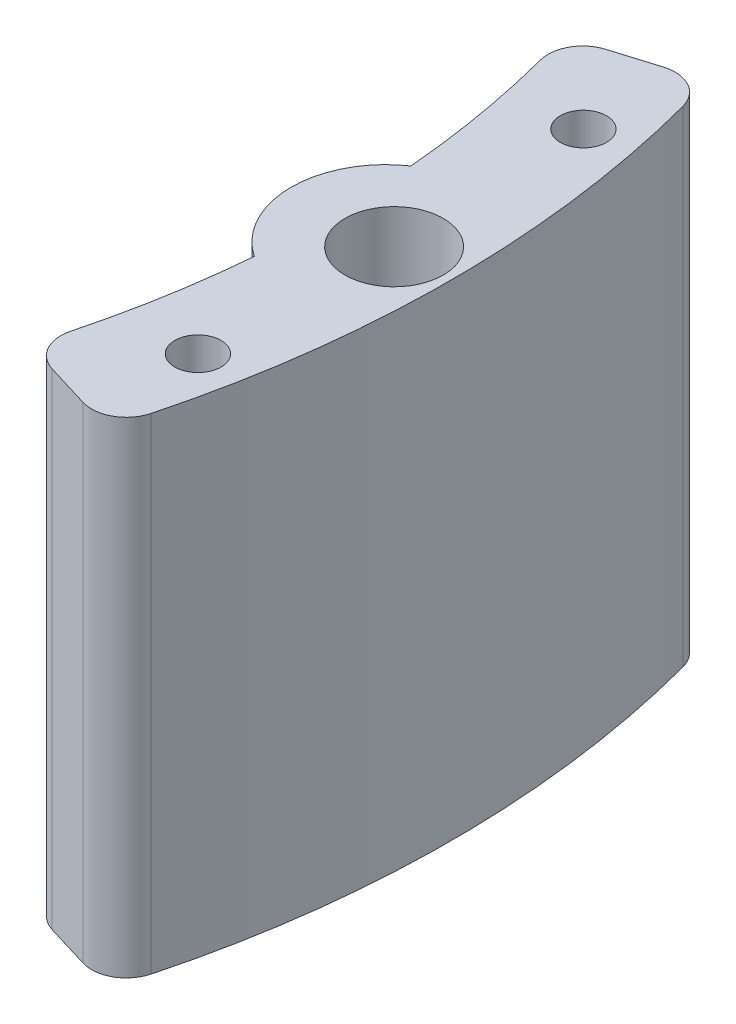
ISO-10303-21;
HEADER;
FILE_DESCRIPTION(('STEP AP214'),'2;1');
FILE_NAME('part.step','',(''),(''),'','','');
FILE_SCHEMA(('AUTOMOTIVE_DESIGN { 1 0 10303 214 1 1 1 1 }'));
ENDSEC;
DATA;
#1=APPLICATION_CONTEXT('core data for automotive mechanical design processes');
#2=APPLICATION_PROTOCOL_DEFINITION('international standard','automotive_design',2000,#1);
#3=PRODUCT_CONTEXT('',#1,'mechanical');
#4=PRODUCT('Part','Part','',(#3));
#5=PRODUCT_RELATED_PRODUCT_CATEGORY('part','',(#4));
#6=PRODUCT_DEFINITION_FORMATION('','',#4);
#7=PRODUCT_DEFINITION_CONTEXT('part definition',#1,'design');
#8=PRODUCT_DEFINITION('design','',#6,#7);
#9=PRODUCT_DEFINITION_SHAPE('','',#8);
#10=(LENGTH_UNIT() NAMED_UNIT(*) SI_UNIT(.MILLI.,.METRE.));
#11=(NAMED_UNIT(*) PLANE_ANGLE_UNIT() SI_UNIT($,.RADIAN.));
#12=(NAMED_UNIT(*) SI_UNIT($,.STERADIAN.) SOLID_ANGLE_UNIT());
#13=UNCERTAINTY_MEASURE_WITH_UNIT(LENGTH_MEASURE(1.E-05),#10,'distance_accuracy_value','');
#14=(GEOMETRIC_REPRESENTATION_CONTEXT(3) GLOBAL_UNCERTAINTY_ASSIGNED_CONTEXT((#13)) GLOBAL_UNIT_ASSIGNED_CONTEXT((#10,
#11,#12)) REPRESENTATION_CONTEXT('',''));
#15=CARTESIAN_POINT('',(0.,0.,0.));
#16=DIRECTION('',(0.,0.,1.));
#17=DIRECTION('',(1.,0.,0.));
#18=AXIS2_PLACEMENT_3D('',#15,#16,#17);
#19=CARTESIAN_POINT('',(-84.3014474439977,42.,0.));
#20=DIRECTION('',(0.,-1.,0.));
#21=DIRECTION('',(0.,0.,-1.));
#22=AXIS2_PLACEMENT_3D('',#19,#20,#21);
#23=CYLINDRICAL_SURFACE('',#22,80.);
#24=DIRECTION('',(0.,-1.,0.));
#25=VECTOR('',#24,1.);
#26=CARTESIAN_POINT('',(-4.58853389125035,21.,6.77136713908091));
#27=LINE('',#26,#25);
#28=CARTESIAN_POINT('',(-4.58853389125035,0.,6.77136713908091));
#29=VERTEX_POINT('',#28);
#30=CARTESIAN_POINT('',(-4.58853389125033,42.,6.77136713908088));
#31=VERTEX_POINT('',#30);
#32=EDGE_CURVE('E136',#29,#31,#27,.F.);
#33=ORIENTED_EDGE('',*,*,#32,.F.);
#34=CARTESIAN_POINT('',(-84.3014474439977,0.,0.));
#35=DIRECTION('',(0.,-1.,0.));
#36=DIRECTION('',(0.,0.,1.));
#37=AXIS2_PLACEMENT_3D('',#34,#35,#36);
#38=CIRCLE('',#37,80.);
#39=CARTESIAN_POINT('',(-6.9228749005604,0.,20.3114871720416));
#40=VERTEX_POINT('',#39);
#41=EDGE_CURVE('E123',#29,#40,#38,.T.);
#42=ORIENTED_EDGE('',*,*,#41,.T.);
#43=DIRECTION('',(0.,-1.,0.));
#44=VECTOR('',#43,1.);
#45=CARTESIAN_POINT('',(-6.9228749005604,42.,20.3114871720416));
#46=LINE('',#45,#44);
#47=CARTESIAN_POINT('',(-6.9228749005604,42.,20.3114871720416));
#48=VERTEX_POINT('',#47);
#49=EDGE_CURVE('E229',#40,#48,#46,.F.);
#50=ORIENTED_EDGE('',*,*,#49,.T.);
#51=CARTESIAN_POINT('',(-84.3014474439977,42.,0.));
#52=DIRECTION('',(0.,-1.,0.));
#53=DIRECTION('',(0.,0.,1.));
#54=AXIS2_PLACEMENT_3D('',#51,#52,#53);
#55=CIRCLE('',#54,80.);
#56=EDGE_CURVE('E59',#31,#48,#55,.T.);
#57=ORIENTED_EDGE('',*,*,#56,.F.);
#58=EDGE_LOOP('',(#33,#42,#50,#57));
#59=FACE_BOUND('',#58,.T.);
#60=ADVANCED_FACE('F43',(#59),#23,.F.);
#61=DIRECTION('',(0.,-1.,0.));
#62=VECTOR('',#61,1.);
#63=CARTESIAN_POINT('',(-4.58853389125035,21.,-6.77136713908091));
#64=LINE('',#63,#62);
#65=CARTESIAN_POINT('',(-4.58853389125033,42.,-6.77136713908088));
#66=VERTEX_POINT('',#65);
#67=CARTESIAN_POINT('',(-4.58853389125033,0.,-6.77136713908088));
#68=VERTEX_POINT('',#67);
#69=EDGE_CURVE('E67',#66,#68,#64,.T.);
#70=ORIENTED_EDGE('',*,*,#69,.F.);
#71=CARTESIAN_POINT('',(-6.9228749005604,42.,-20.3114871720416));
#72=VERTEX_POINT('',#71);
#73=EDGE_CURVE('E164',#72,#66,#55,.T.);
#74=ORIENTED_EDGE('',*,*,#73,.F.);
#75=DIRECTION('',(0.,-1.,0.));
#76=VECTOR('',#75,1.);
#77=CARTESIAN_POINT('',(-6.9228749005604,42.,-20.3114871720416));
#78=LINE('',#77,#76);
#79=CARTESIAN_POINT('',(-6.9228749005604,0.,-20.3114871720416));
#80=VERTEX_POINT('',#79);
#81=EDGE_CURVE('E232',#72,#80,#78,.T.);
#82=ORIENTED_EDGE('',*,*,#81,.T.);
#83=EDGE_CURVE('E133',#80,#68,#38,.T.);
#84=ORIENTED_EDGE('',*,*,#83,.T.);
#85=EDGE_LOOP('',(#70,#74,#82,#84));
#86=FACE_BOUND('',#85,.T.);
#87=ADVANCED_FACE('F266',(#86),#23,.F.);
#88=CARTESIAN_POINT('',(-7.70531331828415,42.,23.0874909203165));
#89=DIRECTION('',(0.291249910817092,0.,-0.956647003575005));
#90=DIRECTION('',(-0.956647003575005,0.,-0.291249910817092));
#91=AXIS2_PLACEMENT_3D('',#88,#89,#90);
#92=PLANE('',#91);
#93=DIRECTION('',(0.956647003575005,0.,0.291249910817092));
#94=VECTOR('',#93,1.);
#95=CARTESIAN_POINT('',(-7.70531331828415,42.,23.0874909203165));
#96=LINE('',#95,#94);
#97=CARTESIAN_POINT('',(-4.89492816263278,42.,23.9431089517182));
#98=VERTEX_POINT('',#97);
#99=CARTESIAN_POINT('',(-1.06558646064553,42.,25.1089469515489));
#100=VERTEX_POINT('',#99);
#101=EDGE_CURVE('E167',#98,#100,#96,.T.);
#102=ORIENTED_EDGE('',*,*,#101,.F.);
#103=DIRECTION('',(0.,-1.,0.));
#104=VECTOR('',#103,1.);
#105=CARTESIAN_POINT('',(-4.89492816263278,42.,23.9431089517182));
#106=LINE('',#105,#104);
#107=CARTESIAN_POINT('',(-4.89492816263278,0.,23.9431089517182));
#108=VERTEX_POINT('',#107);
#109=EDGE_CURVE('E11',#98,#108,#106,.T.);
#110=ORIENTED_EDGE('',*,*,#109,.T.);
#111=DIRECTION('',(0.956647003575005,0.,0.291249910817092));
#112=VECTOR('',#111,1.);
#113=CARTESIAN_POINT('',(-7.70531331828415,0.,23.0874909203165));
#114=LINE('',#113,#112);
#115=CARTESIAN_POINT('',(-1.06558646064553,0.,25.1089469515489));
#116=VERTEX_POINT('',#115);
#117=EDGE_CURVE('E181',#108,#116,#114,.T.);
#118=ORIENTED_EDGE('',*,*,#117,.T.);
#119=DIRECTION('',(0.,-1.,0.));
#120=VECTOR('',#119,1.);
#121=CARTESIAN_POINT('',(-1.06558646064553,42.,25.1089469515489));
#122=LINE('',#121,#120);
#123=EDGE_CURVE('E52',#116,#100,#122,.F.);
#124=ORIENTED_EDGE('',*,*,#123,.T.);
#125=EDGE_LOOP('',(#102,#110,#118,#124));
#126=FACE_BOUND('',#125,.T.);
#127=ADVANCED_FACE('F239',(#126),#92,.F.);
#128=CARTESIAN_POINT('',(-84.3014474439977,42.,0.));
#129=DIRECTION('',(0.,-1.,0.));
#130=DIRECTION('',(0.,0.,-1.));
#131=AXIS2_PLACEMENT_3D('',#128,#129,#130);
#132=CYLINDRICAL_SURFACE('',#131,90.);
#133=CARTESIAN_POINT('',(-84.3014474439977,0.,0.));
#134=DIRECTION('',(0.,1.,0.));
#135=DIRECTION('',(0.,0.,1.));
#136=AXIS2_PLACEMENT_3D('',#133,#134,#135);
#137=CIRCLE('',#136,90.);
#138=CARTESIAN_POINT('',(2.70849467579899,0.,23.0058682146454));
#139=VERTEX_POINT('',#138);
#140=CARTESIAN_POINT('',(2.70849467579898,0.,-23.0058682146454));
#141=VERTEX_POINT('',#140);
#142=EDGE_CURVE('E185',#139,#141,#137,.T.);
#143=ORIENTED_EDGE('',*,*,#142,.T.);
#144=DIRECTION('',(0.,-1.,0.));
#145=VECTOR('',#144,1.);
#146=CARTESIAN_POINT('',(2.70849467579898,42.,-23.0058682146454));
#147=LINE('',#146,#145);
#148=CARTESIAN_POINT('',(2.70849467579898,42.,-23.0058682146454));
#149=VERTEX_POINT('',#148);
#150=EDGE_CURVE('E214',#141,#149,#147,.F.);
#151=ORIENTED_EDGE('',*,*,#150,.T.);
#152=CARTESIAN_POINT('',(-84.3014474439977,42.,0.));
#153=DIRECTION('',(0.,1.,0.));
#154=DIRECTION('',(0.,0.,1.));
#155=AXIS2_PLACEMENT_3D('',#152,#153,#154);
#156=CIRCLE('',#155,90.);
#157=CARTESIAN_POINT('',(2.70849467579899,42.,23.0058682146454));
#158=VERTEX_POINT('',#157);
#159=EDGE_CURVE('E171',#158,#149,#156,.T.);
#160=ORIENTED_EDGE('',*,*,#159,.F.);
#161=DIRECTION('',(0.,-1.,0.));
#162=VECTOR('',#161,1.);
#163=CARTESIAN_POINT('',(2.70849467579898,42.,23.0058682146454));
#164=LINE('',#163,#162);
#165=EDGE_CURVE('E210',#158,#139,#164,.T.);
#166=ORIENTED_EDGE('',*,*,#165,.T.);
#167=EDGE_LOOP('',(#143,#151,#160,#166));
#168=FACE_BOUND('',#167,.T.);
#169=ADVANCED_FACE('F251',(#168),#132,.T.);
#170=CARTESIAN_POINT('',(-7.70531331828414,42.,-23.0874909203166));
#171=DIRECTION('',(0.29124991081709,0.,0.956647003575006));
#172=DIRECTION('',(0.956647003575006,0.,-0.291249910817091));
#173=AXIS2_PLACEMENT_3D('',#170,#171,#172);
#174=PLANE('',#173);
#175=DIRECTION('',(-0.956647003575006,0.,0.291249910817091));
#176=VECTOR('',#175,1.);
#177=CARTESIAN_POINT('',(-7.70531331828414,42.,-23.0874909203166));
#178=LINE('',#177,#176);
#179=CARTESIAN_POINT('',(-1.06558646064554,42.,-25.1089469515489));
#180=VERTEX_POINT('',#179);
#181=CARTESIAN_POINT('',(-4.8949281626328,42.,-23.9431089517182));
#182=VERTEX_POINT('',#181);
#183=EDGE_CURVE('E175',#180,#182,#178,.T.);
#184=ORIENTED_EDGE('',*,*,#183,.F.);
#185=DIRECTION('',(0.,-1.,0.));
#186=VECTOR('',#185,1.);
#187=CARTESIAN_POINT('',(-1.06558646064554,42.,-25.1089469515489));
#188=LINE('',#187,#186);
#189=CARTESIAN_POINT('',(-1.06558646064554,0.,-25.1089469515489));
#190=VERTEX_POINT('',#189);
#191=EDGE_CURVE('E195',#180,#190,#188,.T.);
#192=ORIENTED_EDGE('',*,*,#191,.T.);
#193=DIRECTION('',(-0.956647003575006,0.,0.291249910817091));
#194=VECTOR('',#193,1.);
#195=CARTESIAN_POINT('',(-7.70531331828414,0.,-23.0874909203166));
#196=LINE('',#195,#194);
#197=CARTESIAN_POINT('',(-4.8949281626328,0.,-23.9431089517182));
#198=VERTEX_POINT('',#197);
#199=EDGE_CURVE('E189',#190,#198,#196,.T.);
#200=ORIENTED_EDGE('',*,*,#199,.T.);
#201=DIRECTION('',(0.,-1.,0.));
#202=VECTOR('',#201,1.);
#203=CARTESIAN_POINT('',(-4.8949281626328,42.,-23.9431089517182));
#204=LINE('',#203,#202);
#205=EDGE_CURVE('E178',#198,#182,#204,.F.);
#206=ORIENTED_EDGE('',*,*,#205,.T.);
#207=EDGE_LOOP('',(#184,#192,#200,#206));
#208=FACE_BOUND('',#207,.T.);
#209=ADVANCED_FACE('F260',(#208),#174,.F.);
#210=CARTESIAN_POINT('',(-84.3014474439977,42.,0.));
#211=DIRECTION('',(0.,1.,0.));
#212=DIRECTION('',(0.,0.,1.));
#213=AXIS2_PLACEMENT_3D('',#210,#211,#212);
#214=PLANE('',#213);
#215=CARTESIAN_POINT('',(0.266407335288432,42.,16.5));
#216=DIRECTION('',(0.,-1.,0.));
#217=DIRECTION('',(0.,0.,-1.));
#218=AXIS2_PLACEMENT_3D('',#215,#216,#217);
#219=CIRCLE('',#218,2.);
#220=CARTESIAN_POINT('',(0.266407335288432,42.,14.5));
#221=VERTEX_POINT('',#220);
#222=EDGE_CURVE('E146',#221,#221,#219,.T.);
#223=ORIENTED_EDGE('',*,*,#222,.T.);
#224=EDGE_LOOP('',(#223));
#225=FACE_BOUND('',#224,.T.);
#226=CARTESIAN_POINT('',(0.106129728212272,42.,-17.));
#227=DIRECTION('',(0.,-1.,0.));
#228=DIRECTION('',(0.,0.,-1.));
#229=AXIS2_PLACEMENT_3D('',#226,#227,#228);
#230=CIRCLE('',#229,2.);
#231=CARTESIAN_POINT('',(0.106129728212272,42.,-19.));
#232=VERTEX_POINT('',#231);
#233=EDGE_CURVE('E446',#232,#232,#230,.T.);
#234=ORIENTED_EDGE('',*,*,#233,.T.);
#235=EDGE_LOOP('',(#234));
#236=FACE_BOUND('',#235,.T.);
#237=ORIENTED_EDGE('',*,*,#73,.T.);
#238=CARTESIAN_POINT('',(0.,42.,0.));
#239=DIRECTION('',(0.,1.,0.));
#240=DIRECTION('',(0.,0.,1.));
#241=AXIS2_PLACEMENT_3D('',#238,#239,#240);
#242=CIRCLE('',#241,8.17961222817915);
#243=EDGE_CURVE('E145',#66,#31,#242,.T.);
#244=ORIENTED_EDGE('',*,*,#243,.T.);
#245=ORIENTED_EDGE('',*,*,#56,.T.);
#246=CARTESIAN_POINT('',(-4.0211784301815,42.,21.0731679409932));
#247=DIRECTION('',(0.,1.,0.));
#248=DIRECTION('',(0.,0.,1.));
#249=AXIS2_PLACEMENT_3D('',#246,#247,#248);
#250=CIRCLE('',#249,3.);
#251=EDGE_CURVE('E220',#48,#98,#250,.T.);
#252=ORIENTED_EDGE('',*,*,#251,.T.);
#253=ORIENTED_EDGE('',*,*,#101,.T.);
#254=CARTESIAN_POINT('',(-0.191836728194256,42.,22.2390059408239));
#255=DIRECTION('',(0.,1.,0.));
#256=DIRECTION('',(0.,0.,1.));
#257=AXIS2_PLACEMENT_3D('',#254,#255,#256);
#258=CIRCLE('',#257,3.);
#259=EDGE_CURVE('E217',#100,#158,#258,.T.);
#260=ORIENTED_EDGE('',*,*,#259,.T.);
#261=ORIENTED_EDGE('',*,*,#159,.T.);
#262=CARTESIAN_POINT('',(-0.19183672819427,42.,-22.2390059408239));
#263=DIRECTION('',(0.,1.,0.));
#264=DIRECTION('',(0.,0.,1.));
#265=AXIS2_PLACEMENT_3D('',#262,#263,#264);
#266=CIRCLE('',#265,3.);
#267=EDGE_CURVE('E226',#149,#180,#266,.T.);
#268=ORIENTED_EDGE('',*,*,#267,.T.);
#269=ORIENTED_EDGE('',*,*,#183,.T.);
#270=CARTESIAN_POINT('',(-4.02117843018153,42.,-21.0731679409932));
#271=DIRECTION('',(0.,1.,0.));
#272=DIRECTION('',(0.,0.,1.));
#273=AXIS2_PLACEMENT_3D('',#270,#271,#272);
#274=CIRCLE('',#273,3.);
#275=EDGE_CURVE('E223',#182,#72,#274,.T.);
#276=ORIENTED_EDGE('',*,*,#275,.T.);
#277=EDGE_LOOP('',(#237,#244,#245,#252,#253,#260,#261,#268,#269,#276));
#278=FACE_BOUND('',#277,.T.);
#279=CARTESIAN_POINT('',(0.733117744973949,42.,0.));
#280=DIRECTION('',(0.,1.,0.));
#281=DIRECTION('',(0.,0.,1.));
#282=AXIS2_PLACEMENT_3D('',#279,#280,#281);
#283=CIRCLE('',#282,4.25);
#284=CARTESIAN_POINT('',(0.733117744973949,42.,4.25));
#285=VERTEX_POINT('',#284);
#286=EDGE_CURVE('E141',#285,#285,#283,.T.);
#287=ORIENTED_EDGE('',*,*,#286,.F.);
#288=EDGE_LOOP('',(#287));
#289=FACE_BOUND('',#288,.T.);
#290=ADVANCED_FACE('F244',(#225,#236,#278,#289),#214,.T.);
#291=CARTESIAN_POINT('',(-84.3014474439977,0.,0.));
#292=DIRECTION('',(0.,1.,0.));
#293=DIRECTION('',(0.,0.,1.));
#294=AXIS2_PLACEMENT_3D('',#291,#292,#293);
#295=PLANE('',#294);
#296=CARTESIAN_POINT('',(0.266407335288432,0.,16.5));
#297=DIRECTION('',(0.,-1.,0.));
#298=DIRECTION('',(0.,0.,-1.));
#299=AXIS2_PLACEMENT_3D('',#296,#297,#298);
#300=CIRCLE('',#299,2.);
#301=CARTESIAN_POINT('',(0.266407335288432,0.,14.5));
#302=VERTEX_POINT('',#301);
#303=EDGE_CURVE('E152',#302,#302,#300,.T.);
#304=ORIENTED_EDGE('',*,*,#303,.F.);
#305=EDGE_LOOP('',(#304));
#306=FACE_BOUND('',#305,.T.);
#307=CARTESIAN_POINT('',(0.106129728212272,0.,-17.));
#308=DIRECTION('',(0.,-1.,0.));
#309=DIRECTION('',(0.,0.,-1.));
#310=AXIS2_PLACEMENT_3D('',#307,#308,#309);
#311=CIRCLE('',#310,2.);
#312=CARTESIAN_POINT('',(0.106129728212272,0.,-19.));
#313=VERTEX_POINT('',#312);
#314=EDGE_CURVE('E450',#313,#313,#311,.T.);
#315=ORIENTED_EDGE('',*,*,#314,.F.);
#316=EDGE_LOOP('',(#315));
#317=FACE_BOUND('',#316,.T.);
#318=ORIENTED_EDGE('',*,*,#41,.F.);
#319=CARTESIAN_POINT('',(0.,0.,0.));
#320=DIRECTION('',(0.,1.,0.));
#321=DIRECTION('',(0.,0.,1.));
#322=AXIS2_PLACEMENT_3D('',#319,#320,#321);
#323=CIRCLE('',#322,8.17961222817915);
#324=EDGE_CURVE('E128',#68,#29,#323,.T.);
#325=ORIENTED_EDGE('',*,*,#324,.F.);
#326=ORIENTED_EDGE('',*,*,#83,.F.);
#327=CARTESIAN_POINT('',(-4.02117843018153,0.,-21.0731679409932));
#328=DIRECTION('',(0.,1.,0.));
#329=DIRECTION('',(0.,0.,1.));
#330=AXIS2_PLACEMENT_3D('',#327,#328,#329);
#331=CIRCLE('',#330,3.);
#332=EDGE_CURVE('E204',#80,#198,#331,.F.);
#333=ORIENTED_EDGE('',*,*,#332,.T.);
#334=ORIENTED_EDGE('',*,*,#199,.F.);
#335=CARTESIAN_POINT('',(-0.19183672819427,0.,-22.2390059408239));
#336=DIRECTION('',(0.,1.,0.));
#337=DIRECTION('',(0.,0.,1.));
#338=AXIS2_PLACEMENT_3D('',#335,#336,#337);
#339=CIRCLE('',#338,3.);
#340=EDGE_CURVE('E207',#190,#141,#339,.F.);
#341=ORIENTED_EDGE('',*,*,#340,.T.);
#342=ORIENTED_EDGE('',*,*,#142,.F.);
#343=CARTESIAN_POINT('',(-0.191836728194256,0.,22.2390059408239));
#344=DIRECTION('',(0.,1.,0.));
#345=DIRECTION('',(0.,0.,1.));
#346=AXIS2_PLACEMENT_3D('',#343,#344,#345);
#347=CIRCLE('',#346,3.);
#348=EDGE_CURVE('E199',#139,#116,#347,.F.);
#349=ORIENTED_EDGE('',*,*,#348,.T.);
#350=ORIENTED_EDGE('',*,*,#117,.F.);
#351=CARTESIAN_POINT('',(-4.0211784301815,0.,21.0731679409932));
#352=DIRECTION('',(0.,1.,0.));
#353=DIRECTION('',(0.,0.,1.));
#354=AXIS2_PLACEMENT_3D('',#351,#352,#353);
#355=CIRCLE('',#354,3.);
#356=EDGE_CURVE('E130',#108,#40,#355,.F.);
#357=ORIENTED_EDGE('',*,*,#356,.T.);
#358=EDGE_LOOP('',(#318,#325,#326,#333,#334,#341,#342,#349,#350,#357));
#359=FACE_BOUND('',#358,.T.);
#360=CARTESIAN_POINT('',(0.733117744973949,0.,0.));
#361=DIRECTION('',(0.,1.,0.));
#362=DIRECTION('',(0.,0.,1.));
#363=AXIS2_PLACEMENT_3D('',#360,#361,#362);
#364=CIRCLE('',#363,4.25);
#365=CARTESIAN_POINT('',(0.733117744973949,0.,4.25));
#366=VERTEX_POINT('',#365);
#367=EDGE_CURVE('E134',#366,#366,#364,.T.);
#368=ORIENTED_EDGE('',*,*,#367,.T.);
#369=EDGE_LOOP('',(#368));
#370=FACE_BOUND('',#369,.T.);
#371=ADVANCED_FACE('F124',(#306,#317,#359,#370),#295,.F.);
#372=CARTESIAN_POINT('',(-0.19183672819427,42.,-22.2390059408239));
#373=DIRECTION('',(0.,-1.,0.));
#374=DIRECTION('',(0.,0.,-1.));
#375=AXIS2_PLACEMENT_3D('',#372,#373,#374);
#376=CYLINDRICAL_SURFACE('',#375,3.);
#377=ORIENTED_EDGE('',*,*,#267,.F.);
#378=ORIENTED_EDGE('',*,*,#150,.F.);
#379=ORIENTED_EDGE('',*,*,#340,.F.);
#380=ORIENTED_EDGE('',*,*,#191,.F.);
#381=EDGE_LOOP('',(#377,#378,#379,#380));
#382=FACE_BOUND('',#381,.T.);
#383=ADVANCED_FACE('F257',(#382),#376,.T.);
#384=CARTESIAN_POINT('',(-4.02117843018153,42.,-21.0731679409932));
#385=DIRECTION('',(0.,-1.,0.));
#386=DIRECTION('',(0.,0.,-1.));
#387=AXIS2_PLACEMENT_3D('',#384,#385,#386);
#388=CYLINDRICAL_SURFACE('',#387,3.);
#389=ORIENTED_EDGE('',*,*,#275,.F.);
#390=ORIENTED_EDGE('',*,*,#205,.F.);
#391=ORIENTED_EDGE('',*,*,#332,.F.);
#392=ORIENTED_EDGE('',*,*,#81,.F.);
#393=EDGE_LOOP('',(#389,#390,#391,#392));
#394=FACE_BOUND('',#393,.T.);
#395=ADVANCED_FACE('F265',(#394),#388,.T.);
#396=CARTESIAN_POINT('',(-4.0211784301815,42.,21.0731679409932));
#397=DIRECTION('',(0.,-1.,0.));
#398=DIRECTION('',(0.,0.,-1.));
#399=AXIS2_PLACEMENT_3D('',#396,#397,#398);
#400=CYLINDRICAL_SURFACE('',#399,3.);
#401=ORIENTED_EDGE('',*,*,#251,.F.);
#402=ORIENTED_EDGE('',*,*,#49,.F.);
#403=ORIENTED_EDGE('',*,*,#356,.F.);
#404=ORIENTED_EDGE('',*,*,#109,.F.);
#405=EDGE_LOOP('',(#401,#402,#403,#404));
#406=FACE_BOUND('',#405,.T.);
#407=ADVANCED_FACE('F269',(#406),#400,.T.);
#408=CARTESIAN_POINT('',(-0.191836728194256,42.,22.2390059408239));
#409=DIRECTION('',(0.,-1.,0.));
#410=DIRECTION('',(0.,0.,-1.));
#411=AXIS2_PLACEMENT_3D('',#408,#409,#410);
#412=CYLINDRICAL_SURFACE('',#411,3.);
#413=ORIENTED_EDGE('',*,*,#259,.F.);
#414=ORIENTED_EDGE('',*,*,#123,.F.);
#415=ORIENTED_EDGE('',*,*,#348,.F.);
#416=ORIENTED_EDGE('',*,*,#165,.F.);
#417=EDGE_LOOP('',(#413,#414,#415,#416));
#418=FACE_BOUND('',#417,.T.);
#419=ADVANCED_FACE('F45',(#418),#412,.T.);
#420=CARTESIAN_POINT('',(0.733117744973949,0.,0.));
#421=DIRECTION('',(0.,1.,0.));
#422=DIRECTION('',(0.,0.,1.));
#423=AXIS2_PLACEMENT_3D('',#420,#421,#422);
#424=CYLINDRICAL_SURFACE('',#423,4.25);
#425=CARTESIAN_POINT('',(0.733117744973949,0.,4.25));
#426=CARTESIAN_POINT('',(0.733117744973949,0.437499999999999,4.25));
#427=CARTESIAN_POINT('',(0.733117744973949,0.875,4.25));
#428=CARTESIAN_POINT('',(0.733117744973949,1.75,4.25));
#429=CARTESIAN_POINT('',(0.733117744973949,2.1875,4.25));
#430=CARTESIAN_POINT('',(0.733117744973949,3.0625,4.25));
#431=CARTESIAN_POINT('',(0.733117744973949,3.5,4.25));
#432=CARTESIAN_POINT('',(0.733117744973949,4.375,4.25));
#433=CARTESIAN_POINT('',(0.733117744973949,4.8125,4.25));
#434=CARTESIAN_POINT('',(0.733117744973949,5.6875,4.25));
#435=CARTESIAN_POINT('',(0.733117744973949,6.125,4.25));
#436=CARTESIAN_POINT('',(0.733117744973949,7.,4.25));
#437=CARTESIAN_POINT('',(0.733117744973949,7.4375,4.25));
#438=CARTESIAN_POINT('',(0.733117744973949,8.3125,4.25));
#439=CARTESIAN_POINT('',(0.733117744973949,8.75,4.25));
#440=CARTESIAN_POINT('',(0.733117744973949,9.625,4.25));
#441=CARTESIAN_POINT('',(0.733117744973949,10.0625,4.25));
#442=CARTESIAN_POINT('',(0.733117744973949,10.9375,4.25));
#443=CARTESIAN_POINT('',(0.733117744973949,11.375,4.25));
#444=CARTESIAN_POINT('',(0.733117744973949,12.25,4.25));
#445=CARTESIAN_POINT('',(0.733117744973949,12.6875,4.25));
#446=CARTESIAN_POINT('',(0.733117744973949,13.5625,4.25));
#447=CARTESIAN_POINT('',(0.733117744973949,14.,4.25));
#448=CARTESIAN_POINT('',(0.733117744973949,14.875,4.25));
#449=CARTESIAN_POINT('',(0.733117744973949,15.3125,4.25));
#450=CARTESIAN_POINT('',(0.733117744973949,16.1875,4.25));
#451=CARTESIAN_POINT('',(0.733117744973949,16.625,4.25));
#452=CARTESIAN_POINT('',(0.733117744973949,17.5,4.25));
#453=CARTESIAN_POINT('',(0.733117744973949,17.9375,4.25));
#454=CARTESIAN_POINT('',(0.733117744973949,18.8125,4.25));
#455=CARTESIAN_POINT('',(0.733117744973949,19.25,4.25));
#456=CARTESIAN_POINT('',(0.733117744973949,20.125,4.25));
#457=CARTESIAN_POINT('',(0.733117744973949,20.5625,4.25));
#458=CARTESIAN_POINT('',(0.733117744973949,21.4375,4.25));
#459=CARTESIAN_POINT('',(0.733117744973949,21.875,4.25));
#460=CARTESIAN_POINT('',(0.733117744973949,22.75,4.25));
#461=CARTESIAN_POINT('',(0.733117744973949,23.1875,4.25));
#462=CARTESIAN_POINT('',(0.733117744973949,24.0625,4.25));
#463=CARTESIAN_POINT('',(0.733117744973949,24.5,4.25));
#464=CARTESIAN_POINT('',(0.733117744973949,25.375,4.25));
#465=CARTESIAN_POINT('',(0.733117744973949,25.8125,4.25));
#466=CARTESIAN_POINT('',(0.733117744973949,26.6875,4.25));
#467=CARTESIAN_POINT('',(0.733117744973949,27.125,4.25));
#468=CARTESIAN_POINT('',(0.733117744973949,28.,4.25));
#469=CARTESIAN_POINT('',(0.733117744973949,28.4375,4.25));
#470=CARTESIAN_POINT('',(0.733117744973949,29.3125,4.25));
#471=CARTESIAN_POINT('',(0.733117744973949,29.75,4.25));
#472=CARTESIAN_POINT('',(0.733117744973949,30.625,4.25));
#473=CARTESIAN_POINT('',(0.733117744973949,31.0625,4.25));
#474=CARTESIAN_POINT('',(0.733117744973949,31.9375,4.25));
#475=CARTESIAN_POINT('',(0.733117744973949,32.375,4.25));
#476=CARTESIAN_POINT('',(0.733117744973949,33.25,4.25));
#477=CARTESIAN_POINT('',(0.733117744973949,33.6875,4.25));
#478=CARTESIAN_POINT('',(0.733117744973949,34.5625,4.25));
#479=CARTESIAN_POINT('',(0.733117744973949,35.,4.25));
#480=CARTESIAN_POINT('',(0.733117744973949,35.875,4.25));
#481=CARTESIAN_POINT('',(0.733117744973949,36.3125,4.25));
#482=CARTESIAN_POINT('',(0.733117744973949,37.1875,4.25));
#483=CARTESIAN_POINT('',(0.733117744973949,37.625,4.25));
#484=CARTESIAN_POINT('',(0.733117744973949,38.5,4.25));
#485=CARTESIAN_POINT('',(0.733117744973949,38.9375,4.25));
#486=CARTESIAN_POINT('',(0.733117744973949,39.8125,4.25));
#487=CARTESIAN_POINT('',(0.733117744973949,40.25,4.25));
#488=CARTESIAN_POINT('',(0.733117744973949,41.125,4.25));
#489=CARTESIAN_POINT('',(0.733117744973949,41.5625,4.25));
#490=CARTESIAN_POINT('',(0.733117744973949,42.,4.25));
#491=B_SPLINE_CURVE_WITH_KNOTS('',3,(#425,#426,#427,#428,#429,#430,#431,#432,#433,#434,#435,
#436,#437,#438,#439,#440,#441,#442,#443,#444,#445,#446,#447,#448,#449,#450,#451,#452,#453,#454,
#455,#456,#457,#458,#459,#460,#461,#462,#463,#464,#465,#466,#467,#468,#469,#470,#471,#472,#473,
#474,#475,#476,#477,#478,#479,#480,#481,#482,#483,#484,#485,#486,#487,#488,#489,#490),
.UNSPECIFIED.,.F.,.F.,(4,2,2,2,2,2,2,2,2,2,2,2,2,2,2,2,2,2,2,2,2,2,2,2,2,2,2,2,2,2,2,2,4),(0.,
1.3125,2.625,3.9375,5.25,6.5625,7.875,9.1875,10.5,11.8125,13.125,14.4375,15.75,17.0625,18.375,
19.6875,21.,22.3125,23.625,24.9375,26.25,27.5625,28.875,30.1875,31.5,32.8125,34.125,35.4375,
36.75,38.0625,39.375,40.6875,42.),.UNSPECIFIED.);
#492=EDGE_CURVE('BSEAM275',#366,#285,#491,.T.);
#493=ORIENTED_EDGE('',*,*,#367,.F.);
#494=ORIENTED_EDGE('',*,*,#286,.T.);
#495=ORIENTED_EDGE('',*,*,#492,.T.);
#496=ORIENTED_EDGE('',*,*,#492,.F.);
#497=EDGE_LOOP('',(#493,#495,#494,#496));
#498=FACE_BOUND('',#497,.T.);
#499=ADVANCED_FACE('F275',(#498),#424,.F.);
#500=CARTESIAN_POINT('',(0.,42.,0.));
#501=DIRECTION('',(0.,-1.,0.));
#502=DIRECTION('',(0.,0.,-1.));
#503=AXIS2_PLACEMENT_3D('',#500,#501,#502);
#504=CYLINDRICAL_SURFACE('',#503,8.17961222817915);
#505=ORIENTED_EDGE('',*,*,#324,.T.);
#506=ORIENTED_EDGE('',*,*,#32,.T.);
#507=ORIENTED_EDGE('',*,*,#243,.F.);
#508=ORIENTED_EDGE('',*,*,#69,.T.);
#509=EDGE_LOOP('',(#505,#506,#507,#508));
#510=FACE_BOUND('',#509,.T.);
#511=ADVANCED_FACE('F143',(#510),#504,.T.);
#512=CARTESIAN_POINT('',(0.106129728212272,42.,-17.));
#513=DIRECTION('',(0.,-1.,0.));
#514=DIRECTION('',(0.,0.,-1.));
#515=AXIS2_PLACEMENT_3D('',#512,#513,#514);
#516=CYLINDRICAL_SURFACE('',#515,2.);
#517=CARTESIAN_POINT('',(0.106129728212272,42.,-19.));
#518=CARTESIAN_POINT('',(0.106129728212272,41.5625,-19.));
#519=CARTESIAN_POINT('',(0.106129728212272,41.125,-19.));
#520=CARTESIAN_POINT('',(0.106129728212272,40.25,-19.));
#521=CARTESIAN_POINT('',(0.106129728212272,39.8125,-19.));
#522=CARTESIAN_POINT('',(0.106129728212272,38.9375,-19.));
#523=CARTESIAN_POINT('',(0.106129728212272,38.5,-19.));
#524=CARTESIAN_POINT('',(0.106129728212272,37.625,-19.));
#525=CARTESIAN_POINT('',(0.106129728212272,37.1875,-19.));
#526=CARTESIAN_POINT('',(0.106129728212272,36.3125,-19.));
#527=CARTESIAN_POINT('',(0.106129728212272,35.875,-19.));
#528=CARTESIAN_POINT('',(0.106129728212272,35.,-19.));
#529=CARTESIAN_POINT('',(0.106129728212272,34.5625,-19.));
#530=CARTESIAN_POINT('',(0.106129728212272,33.6875,-19.));
#531=CARTESIAN_POINT('',(0.106129728212272,33.25,-19.));
#532=CARTESIAN_POINT('',(0.106129728212272,32.375,-19.));
#533=CARTESIAN_POINT('',(0.106129728212272,31.9375,-19.));
#534=CARTESIAN_POINT('',(0.106129728212272,31.0625,-19.));
#535=CARTESIAN_POINT('',(0.106129728212272,30.625,-19.));
#536=CARTESIAN_POINT('',(0.106129728212272,29.75,-19.));
#537=CARTESIAN_POINT('',(0.106129728212272,29.3125,-19.));
#538=CARTESIAN_POINT('',(0.106129728212272,28.4375,-19.));
#539=CARTESIAN_POINT('',(0.106129728212272,28.,-19.));
#540=CARTESIAN_POINT('',(0.106129728212272,27.125,-19.));
#541=CARTESIAN_POINT('',(0.106129728212272,26.6875,-19.));
#542=CARTESIAN_POINT('',(0.106129728212272,25.8125,-19.));
#543=CARTESIAN_POINT('',(0.106129728212272,25.375,-19.));
#544=CARTESIAN_POINT('',(0.106129728212272,24.5,-19.));
#545=CARTESIAN_POINT('',(0.106129728212272,24.0625,-19.));
#546=CARTESIAN_POINT('',(0.106129728212272,23.1875,-19.));
#547=CARTESIAN_POINT('',(0.106129728212272,22.75,-19.));
#548=CARTESIAN_POINT('',(0.106129728212272,21.875,-19.));
#549=CARTESIAN_POINT('',(0.106129728212272,21.4375,-19.));
#550=CARTESIAN_POINT('',(0.106129728212272,20.5625,-19.));
#551=CARTESIAN_POINT('',(0.106129728212272,20.125,-19.));
#552=CARTESIAN_POINT('',(0.106129728212272,19.25,-19.));
#553=CARTESIAN_POINT('',(0.106129728212272,18.8125,-19.));
#554=CARTESIAN_POINT('',(0.106129728212272,17.9375,-19.));
#555=CARTESIAN_POINT('',(0.106129728212272,17.5,-19.));
#556=CARTESIAN_POINT('',(0.106129728212272,16.625,-19.));
#557=CARTESIAN_POINT('',(0.106129728212272,16.1875,-19.));
#558=CARTESIAN_POINT('',(0.106129728212272,15.3125,-19.));
#559=CARTESIAN_POINT('',(0.106129728212272,14.875,-19.));
#560=CARTESIAN_POINT('',(0.106129728212272,14.,-19.));
#561=CARTESIAN_POINT('',(0.106129728212272,13.5625,-19.));
#562=CARTESIAN_POINT('',(0.106129728212272,12.6875,-19.));
#563=CARTESIAN_POINT('',(0.106129728212272,12.25,-19.));
#564=CARTESIAN_POINT('',(0.106129728212272,11.375,-19.));
#565=CARTESIAN_POINT('',(0.106129728212272,10.9375,-19.));
#566=CARTESIAN_POINT('',(0.106129728212272,10.0625,-19.));
#567=CARTESIAN_POINT('',(0.106129728212272,9.625,-19.));
#568=CARTESIAN_POINT('',(0.106129728212272,8.75,-19.));
#569=CARTESIAN_POINT('',(0.106129728212272,8.3125,-19.));
#570=CARTESIAN_POINT('',(0.106129728212272,7.4375,-19.));
#571=CARTESIAN_POINT('',(0.106129728212272,7.,-19.));
#572=CARTESIAN_POINT('',(0.106129728212272,6.125,-19.));
#573=CARTESIAN_POINT('',(0.106129728212272,5.6875,-19.));
#574=CARTESIAN_POINT('',(0.106129728212272,4.8125,-19.));
#575=CARTESIAN_POINT('',(0.106129728212272,4.375,-19.));
#576=CARTESIAN_POINT('',(0.106129728212272,3.5,-19.));
#577=CARTESIAN_POINT('',(0.106129728212272,3.0625,-19.));
#578=CARTESIAN_POINT('',(0.106129728212272,2.1875,-19.));
#579=CARTESIAN_POINT('',(0.106129728212272,1.75,-19.));
#580=CARTESIAN_POINT('',(0.106129728212272,0.875000000000001,-19.));
#581=CARTESIAN_POINT('',(0.106129728212272,0.4375,-19.));
#582=CARTESIAN_POINT('',(0.106129728212272,0.,-19.));
#583=B_SPLINE_CURVE_WITH_KNOTS('',3,(#517,#518,#519,#520,#521,#522,#523,#524,#525,#526,#527,
#528,#529,#530,#531,#532,#533,#534,#535,#536,#537,#538,#539,#540,#541,#542,#543,#544,#545,#546,
#547,#548,#549,#550,#551,#552,#553,#554,#555,#556,#557,#558,#559,#560,#561,#562,#563,#564,#565,
#566,#567,#568,#569,#570,#571,#572,#573,#574,#575,#576,#577,#578,#579,#580,#581,#582),
.UNSPECIFIED.,.F.,.F.,(4,2,2,2,2,2,2,2,2,2,2,2,2,2,2,2,2,2,2,2,2,2,2,2,2,2,2,2,2,2,2,2,4),(0.,
1.31249999999999,2.625,3.9375,5.25,6.5625,7.875,9.18749999999999,10.5,11.8125,13.125,14.4375,
15.75,17.0625,18.375,19.6875,21.,22.3125,23.625,24.9375,26.25,27.5625,28.875,30.1875,31.5,
32.8125,34.125,35.4375,36.75,38.0625,39.375,40.6875,42.),.UNSPECIFIED.);
#584=EDGE_CURVE('BSEAM324',#232,#313,#583,.T.);
#585=ORIENTED_EDGE('',*,*,#233,.F.);
#586=ORIENTED_EDGE('',*,*,#314,.T.);
#587=ORIENTED_EDGE('',*,*,#584,.T.);
#588=ORIENTED_EDGE('',*,*,#584,.F.);
#589=EDGE_LOOP('',(#585,#587,#586,#588));
#590=FACE_BOUND('',#589,.T.);
#591=ADVANCED_FACE('F324',(#590),#516,.F.);
#592=CARTESIAN_POINT('',(0.266407335288432,42.,16.5));
#593=DIRECTION('',(0.,-1.,0.));
#594=DIRECTION('',(0.,0.,-1.));
#595=AXIS2_PLACEMENT_3D('',#592,#593,#594);
#596=CYLINDRICAL_SURFACE('',#595,2.);
#597=CARTESIAN_POINT('',(0.266407335288432,42.,14.5));
#598=CARTESIAN_POINT('',(0.266407335288432,41.5625,14.5));
#599=CARTESIAN_POINT('',(0.266407335288432,41.125,14.5));
#600=CARTESIAN_POINT('',(0.266407335288432,40.25,14.5));
#601=CARTESIAN_POINT('',(0.266407335288432,39.8125,14.5));
#602=CARTESIAN_POINT('',(0.266407335288432,38.9375,14.5));
#603=CARTESIAN_POINT('',(0.266407335288432,38.5,14.5));
#604=CARTESIAN_POINT('',(0.266407335288432,37.625,14.5));
#605=CARTESIAN_POINT('',(0.266407335288432,37.1875,14.5));
#606=CARTESIAN_POINT('',(0.266407335288432,36.3125,14.5));
#607=CARTESIAN_POINT('',(0.266407335288432,35.875,14.5));
#608=CARTESIAN_POINT('',(0.266407335288432,35.,14.5));
#609=CARTESIAN_POINT('',(0.266407335288432,34.5625,14.5));
#610=CARTESIAN_POINT('',(0.266407335288432,33.6875,14.5));
#611=CARTESIAN_POINT('',(0.266407335288432,33.25,14.5));
#612=CARTESIAN_POINT('',(0.266407335288432,32.375,14.5));
#613=CARTESIAN_POINT('',(0.266407335288432,31.9375,14.5));
#614=CARTESIAN_POINT('',(0.266407335288432,31.0625,14.5));
#615=CARTESIAN_POINT('',(0.266407335288432,30.625,14.5));
#616=CARTESIAN_POINT('',(0.266407335288432,29.75,14.5));
#617=CARTESIAN_POINT('',(0.266407335288432,29.3125,14.5));
#618=CARTESIAN_POINT('',(0.266407335288432,28.4375,14.5));
#619=CARTESIAN_POINT('',(0.266407335288432,28.,14.5));
#620=CARTESIAN_POINT('',(0.266407335288432,27.125,14.5));
#621=CARTESIAN_POINT('',(0.266407335288432,26.6875,14.5));
#622=CARTESIAN_POINT('',(0.266407335288432,25.8125,14.5));
#623=CARTESIAN_POINT('',(0.266407335288432,25.375,14.5));
#624=CARTESIAN_POINT('',(0.266407335288432,24.5,14.5));
#625=CARTESIAN_POINT('',(0.266407335288432,24.0625,14.5));
#626=CARTESIAN_POINT('',(0.266407335288432,23.1875,14.5));
#627=CARTESIAN_POINT('',(0.266407335288432,22.75,14.5));
#628=CARTESIAN_POINT('',(0.266407335288432,21.875,14.5));
#629=CARTESIAN_POINT('',(0.266407335288432,21.4375,14.5));
#630=CARTESIAN_POINT('',(0.266407335288432,20.5625,14.5));
#631=CARTESIAN_POINT('',(0.266407335288432,20.125,14.5));
#632=CARTESIAN_POINT('',(0.266407335288432,19.25,14.5));
#633=CARTESIAN_POINT('',(0.266407335288432,18.8125,14.5));
#634=CARTESIAN_POINT('',(0.266407335288432,17.9375,14.5));
#635=CARTESIAN_POINT('',(0.266407335288432,17.5,14.5));
#636=CARTESIAN_POINT('',(0.266407335288432,16.625,14.5));
#637=CARTESIAN_POINT('',(0.266407335288432,16.1875,14.5));
#638=CARTESIAN_POINT('',(0.266407335288432,15.3125,14.5));
#639=CARTESIAN_POINT('',(0.266407335288432,14.875,14.5));
#640=CARTESIAN_POINT('',(0.266407335288432,14.,14.5));
#641=CARTESIAN_POINT('',(0.266407335288432,13.5625,14.5));
#642=CARTESIAN_POINT('',(0.266407335288432,12.6875,14.5));
#643=CARTESIAN_POINT('',(0.266407335288432,12.25,14.5));
#644=CARTESIAN_POINT('',(0.266407335288432,11.375,14.5));
#645=CARTESIAN_POINT('',(0.266407335288432,10.9375,14.5));
#646=CARTESIAN_POINT('',(0.266407335288432,10.0625,14.5));
#647=CARTESIAN_POINT('',(0.266407335288432,9.625,14.5));
#648=CARTESIAN_POINT('',(0.266407335288432,8.75,14.5));
#649=CARTESIAN_POINT('',(0.266407335288432,8.3125,14.5));
#650=CARTESIAN_POINT('',(0.266407335288432,7.4375,14.5));
#651=CARTESIAN_POINT('',(0.266407335288432,7.,14.5));
#652=CARTESIAN_POINT('',(0.266407335288432,6.125,14.5));
#653=CARTESIAN_POINT('',(0.266407335288432,5.6875,14.5));
#654=CARTESIAN_POINT('',(0.266407335288432,4.8125,14.5));
#655=CARTESIAN_POINT('',(0.266407335288432,4.375,14.5));
#656=CARTESIAN_POINT('',(0.266407335288432,3.5,14.5));
#657=CARTESIAN_POINT('',(0.266407335288432,3.0625,14.5));
#658=CARTESIAN_POINT('',(0.266407335288432,2.1875,14.5));
#659=CARTESIAN_POINT('',(0.266407335288432,1.75,14.5));
#660=CARTESIAN_POINT('',(0.266407335288432,0.875000000000001,14.5));
#661=CARTESIAN_POINT('',(0.266407335288432,0.4375,14.5));
#662=CARTESIAN_POINT('',(0.266407335288432,0.,14.5));
#663=B_SPLINE_CURVE_WITH_KNOTS('',3,(#597,#598,#599,#600,#601,#602,#603,#604,#605,#606,#607,
#608,#609,#610,#611,#612,#613,#614,#615,#616,#617,#618,#619,#620,#621,#622,#623,#624,#625,#626,
#627,#628,#629,#630,#631,#632,#633,#634,#635,#636,#637,#638,#639,#640,#641,#642,#643,#644,#645,
#646,#647,#648,#649,#650,#651,#652,#653,#654,#655,#656,#657,#658,#659,#660,#661,#662),
.UNSPECIFIED.,.F.,.F.,(4,2,2,2,2,2,2,2,2,2,2,2,2,2,2,2,2,2,2,2,2,2,2,2,2,2,2,2,2,2,2,2,4),(0.,
1.31249999999999,2.625,3.9375,5.25,6.5625,7.875,9.18749999999999,10.5,11.8125,13.125,14.4375,
15.75,17.0625,18.375,19.6875,21.,22.3125,23.625,24.9375,26.25,27.5625,28.875,30.1875,31.5,
32.8125,34.125,35.4375,36.75,38.0625,39.375,40.6875,42.),.UNSPECIFIED.);
#664=EDGE_CURVE('BSEAM348',#221,#302,#663,.T.);
#665=ORIENTED_EDGE('',*,*,#222,.F.);
#666=ORIENTED_EDGE('',*,*,#303,.T.);
#667=ORIENTED_EDGE('',*,*,#664,.T.);
#668=ORIENTED_EDGE('',*,*,#664,.F.);
#669=EDGE_LOOP('',(#665,#667,#666,#668));
#670=FACE_BOUND('',#669,.T.);
#671=ADVANCED_FACE('F348',(#670),#596,.F.);
#672=CLOSED_SHELL('',(#60,#87,#127,#169,#209,#290,#371,#383,#395,#407,#419,#499,#511,#591,#671));
#673=MANIFOLD_SOLID_BREP('B2',#672);
#674=ADVANCED_BREP_SHAPE_REPRESENTATION('',(#18,#673),#14);
#675=SHAPE_DEFINITION_REPRESENTATION(#9,#674);
ENDSEC;
END-ISO-10303-21;
